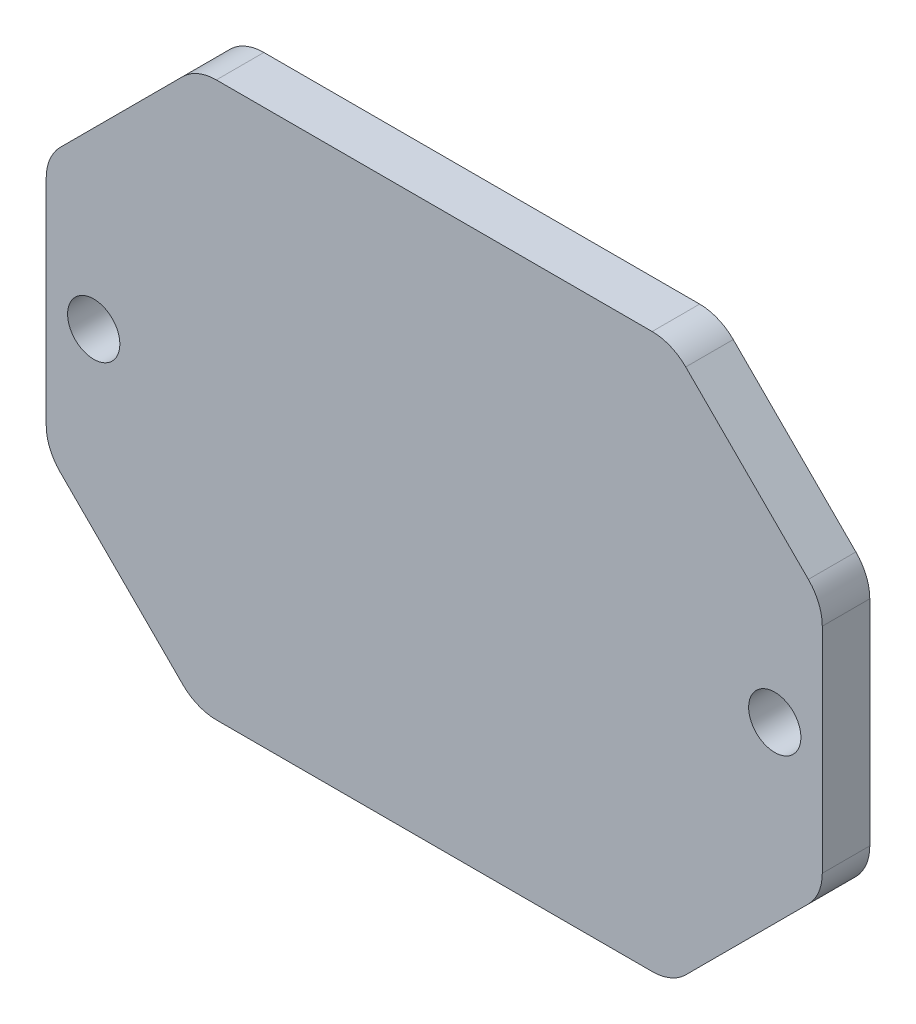
ISO-10303-21;
HEADER;
FILE_DESCRIPTION(('STEP AP214'),'2;1');
FILE_NAME('part.step','',(''),(''),'','','');
FILE_SCHEMA(('AUTOMOTIVE_DESIGN { 1 0 10303 214 1 1 1 1 }'));
ENDSEC;
DATA;
#1=APPLICATION_CONTEXT('core data for automotive mechanical design processes');
#2=APPLICATION_PROTOCOL_DEFINITION('international standard','automotive_design',2000,#1);
#3=PRODUCT_CONTEXT('',#1,'mechanical');
#4=PRODUCT('Part','Part','',(#3));
#5=PRODUCT_RELATED_PRODUCT_CATEGORY('part','',(#4));
#6=PRODUCT_DEFINITION_FORMATION('','',#4);
#7=PRODUCT_DEFINITION_CONTEXT('part definition',#1,'design');
#8=PRODUCT_DEFINITION('design','',#6,#7);
#9=PRODUCT_DEFINITION_SHAPE('','',#8);
#10=(LENGTH_UNIT() NAMED_UNIT(*) SI_UNIT(.MILLI.,.METRE.));
#11=(NAMED_UNIT(*) PLANE_ANGLE_UNIT() SI_UNIT($,.RADIAN.));
#12=(NAMED_UNIT(*) SI_UNIT($,.STERADIAN.) SOLID_ANGLE_UNIT());
#13=UNCERTAINTY_MEASURE_WITH_UNIT(LENGTH_MEASURE(1.E-05),#10,'distance_accuracy_value','');
#14=(GEOMETRIC_REPRESENTATION_CONTEXT(3) GLOBAL_UNCERTAINTY_ASSIGNED_CONTEXT((#13)) GLOBAL_UNIT_ASSIGNED_CONTEXT((#10,
#11,#12)) REPRESENTATION_CONTEXT('',''));
#15=CARTESIAN_POINT('',(0.,0.,0.));
#16=DIRECTION('',(0.,0.,1.));
#17=DIRECTION('',(1.,0.,0.));
#18=AXIS2_PLACEMENT_3D('',#15,#16,#17);
#19=CARTESIAN_POINT('',(24.5,17.4980916030534,3.));
#20=DIRECTION('',(-1.,0.,0.));
#21=DIRECTION('',(0.,-1.,0.));
#22=AXIS2_PLACEMENT_3D('',#19,#20,#21);
#23=PLANE('',#22);
#24=DIRECTION('',(0.,1.,0.));
#25=VECTOR('',#24,1.);
#26=CARTESIAN_POINT('',(24.5,17.4980916030534,3.));
#27=LINE('',#26,#25);
#28=CARTESIAN_POINT('',(24.5,-6.75545091593416,3.));
#29=VERTEX_POINT('',#28);
#30=CARTESIAN_POINT('',(24.5,6.75545091593414,3.));
#31=VERTEX_POINT('',#30);
#32=EDGE_CURVE('E271',#29,#31,#27,.T.);
#33=ORIENTED_EDGE('',*,*,#32,.F.);
#34=DIRECTION('',(0.,0.,1.));
#35=VECTOR('',#34,1.);
#36=CARTESIAN_POINT('',(24.5,-6.75545091593416,0.));
#37=LINE('',#36,#35);
#38=CARTESIAN_POINT('',(24.5,-6.75545091593416,0.));
#39=VERTEX_POINT('',#38);
#40=EDGE_CURVE('E226',#29,#39,#37,.F.);
#41=ORIENTED_EDGE('',*,*,#40,.T.);
#42=DIRECTION('',(0.,1.,0.));
#43=VECTOR('',#42,1.);
#44=CARTESIAN_POINT('',(24.5,17.4980916030534,0.));
#45=LINE('',#44,#43);
#46=CARTESIAN_POINT('',(24.5,6.75545091593414,0.));
#47=VERTEX_POINT('',#46);
#48=EDGE_CURVE('E293',#39,#47,#45,.T.);
#49=ORIENTED_EDGE('',*,*,#48,.T.);
#50=DIRECTION('',(0.,0.,-1.));
#51=VECTOR('',#50,1.);
#52=CARTESIAN_POINT('',(24.5,6.75545091593414,3.));
#53=LINE('',#52,#51);
#54=EDGE_CURVE('E223',#47,#31,#53,.F.);
#55=ORIENTED_EDGE('',*,*,#54,.T.);
#56=EDGE_LOOP('',(#33,#41,#49,#55));
#57=FACE_BOUND('',#56,.T.);
#58=ADVANCED_FACE('F38',(#57),#23,.F.);
#59=CARTESIAN_POINT('',(-24.5,17.4980916030534,3.));
#60=DIRECTION('',(0.,-1.,0.));
#61=DIRECTION('',(0.,0.,-1.));
#62=AXIS2_PLACEMENT_3D('',#59,#60,#61);
#63=PLANE('',#62);
#64=DIRECTION('',(-1.,0.,0.));
#65=VECTOR('',#64,1.);
#66=CARTESIAN_POINT('',(-24.5,17.4980916030534,3.));
#67=LINE('',#66,#65);
#68=CARTESIAN_POINT('',(13.7573593128807,17.4980916030534,3.));
#69=VERTEX_POINT('',#68);
#70=CARTESIAN_POINT('',(-13.7573593128807,17.4980916030534,3.));
#71=VERTEX_POINT('',#70);
#72=EDGE_CURVE('E175',#69,#71,#67,.T.);
#73=ORIENTED_EDGE('',*,*,#72,.F.);
#74=DIRECTION('',(0.,0.,1.));
#75=VECTOR('',#74,1.);
#76=CARTESIAN_POINT('',(13.7573593128807,17.4980916030534,0.));
#77=LINE('',#76,#75);
#78=CARTESIAN_POINT('',(13.7573593128807,17.4980916030534,0.));
#79=VERTEX_POINT('',#78);
#80=EDGE_CURVE('E236',#69,#79,#77,.F.);
#81=ORIENTED_EDGE('',*,*,#80,.T.);
#82=DIRECTION('',(-1.,0.,0.));
#83=VECTOR('',#82,1.);
#84=CARTESIAN_POINT('',(-24.5,17.4980916030534,0.));
#85=LINE('',#84,#83);
#86=CARTESIAN_POINT('',(-13.7573593128807,17.4980916030534,0.));
#87=VERTEX_POINT('',#86);
#88=EDGE_CURVE('E276',#79,#87,#85,.T.);
#89=ORIENTED_EDGE('',*,*,#88,.T.);
#90=DIRECTION('',(0.,0.,-1.));
#91=VECTOR('',#90,1.);
#92=CARTESIAN_POINT('',(-13.7573593128807,17.4980916030534,3.));
#93=LINE('',#92,#91);
#94=EDGE_CURVE('E233',#87,#71,#93,.F.);
#95=ORIENTED_EDGE('',*,*,#94,.T.);
#96=EDGE_LOOP('',(#73,#81,#89,#95));
#97=FACE_BOUND('',#96,.T.);
#98=ADVANCED_FACE('F301',(#97),#63,.F.);
#99=CARTESIAN_POINT('',(-24.5,17.4980916030534,3.));
#100=DIRECTION('',(1.,0.,0.));
#101=DIRECTION('',(0.,1.,0.));
#102=AXIS2_PLACEMENT_3D('',#99,#100,#101);
#103=PLANE('',#102);
#104=DIRECTION('',(0.,-1.,0.));
#105=VECTOR('',#104,1.);
#106=CARTESIAN_POINT('',(-24.5,17.4980916030534,0.));
#107=LINE('',#106,#105);
#108=CARTESIAN_POINT('',(-24.5,6.75545091593416,0.));
#109=VERTEX_POINT('',#108);
#110=CARTESIAN_POINT('',(-24.5,-6.75545091593414,0.));
#111=VERTEX_POINT('',#110);
#112=EDGE_CURVE('E272',#109,#111,#107,.T.);
#113=ORIENTED_EDGE('',*,*,#112,.T.);
#114=DIRECTION('',(0.,0.,-1.));
#115=VECTOR('',#114,1.);
#116=CARTESIAN_POINT('',(-24.5,-6.75545091593414,3.));
#117=LINE('',#116,#115);
#118=CARTESIAN_POINT('',(-24.5,-6.75545091593414,3.));
#119=VERTEX_POINT('',#118);
#120=EDGE_CURVE('E164',#111,#119,#117,.F.);
#121=ORIENTED_EDGE('',*,*,#120,.T.);
#122=DIRECTION('',(0.,-1.,0.));
#123=VECTOR('',#122,1.);
#124=CARTESIAN_POINT('',(-24.5,17.4980916030534,3.));
#125=LINE('',#124,#123);
#126=CARTESIAN_POINT('',(-24.5,6.75545091593416,3.));
#127=VERTEX_POINT('',#126);
#128=EDGE_CURVE('E157',#127,#119,#125,.T.);
#129=ORIENTED_EDGE('',*,*,#128,.F.);
#130=DIRECTION('',(0.,0.,1.));
#131=VECTOR('',#130,1.);
#132=CARTESIAN_POINT('',(-24.5,6.75545091593416,0.));
#133=LINE('',#132,#131);
#134=EDGE_CURVE('E171',#127,#109,#133,.F.);
#135=ORIENTED_EDGE('',*,*,#134,.T.);
#136=EDGE_LOOP('',(#113,#121,#129,#135));
#137=FACE_BOUND('',#136,.T.);
#138=ADVANCED_FACE('F170',(#137),#103,.F.);
#139=CARTESIAN_POINT('',(-24.5,-17.4980916030534,3.));
#140=DIRECTION('',(0.,1.,0.));
#141=DIRECTION('',(0.,0.,1.));
#142=AXIS2_PLACEMENT_3D('',#139,#140,#141);
#143=PLANE('',#142);
#144=DIRECTION('',(1.,0.,0.));
#145=VECTOR('',#144,1.);
#146=CARTESIAN_POINT('',(-24.5,-17.4980916030534,3.));
#147=LINE('',#146,#145);
#148=CARTESIAN_POINT('',(-13.7573593128807,-17.4980916030534,3.));
#149=VERTEX_POINT('',#148);
#150=CARTESIAN_POINT('',(13.7573593128807,-17.4980916030534,3.));
#151=VERTEX_POINT('',#150);
#152=EDGE_CURVE('E174',#149,#151,#147,.T.);
#153=ORIENTED_EDGE('',*,*,#152,.F.);
#154=DIRECTION('',(0.,0.,1.));
#155=VECTOR('',#154,1.);
#156=CARTESIAN_POINT('',(-13.7573593128807,-17.4980916030534,0.));
#157=LINE('',#156,#155);
#158=CARTESIAN_POINT('',(-13.7573593128807,-17.4980916030534,0.));
#159=VERTEX_POINT('',#158);
#160=EDGE_CURVE('E217',#149,#159,#157,.F.);
#161=ORIENTED_EDGE('',*,*,#160,.T.);
#162=DIRECTION('',(1.,0.,0.));
#163=VECTOR('',#162,1.);
#164=CARTESIAN_POINT('',(-24.5,-17.4980916030534,0.));
#165=LINE('',#164,#163);
#166=CARTESIAN_POINT('',(13.7573593128807,-17.4980916030534,0.));
#167=VERTEX_POINT('',#166);
#168=EDGE_CURVE('E267',#159,#167,#165,.T.);
#169=ORIENTED_EDGE('',*,*,#168,.T.);
#170=DIRECTION('',(0.,0.,-1.));
#171=VECTOR('',#170,1.);
#172=CARTESIAN_POINT('',(13.7573593128807,-17.4980916030534,3.));
#173=LINE('',#172,#171);
#174=EDGE_CURVE('E214',#167,#151,#173,.F.);
#175=ORIENTED_EDGE('',*,*,#174,.T.);
#176=EDGE_LOOP('',(#153,#161,#169,#175));
#177=FACE_BOUND('',#176,.T.);
#178=ADVANCED_FACE('F266',(#177),#143,.F.);
#179=CARTESIAN_POINT('',(0.,0.,3.));
#180=DIRECTION('',(0.,0.,1.));
#181=DIRECTION('',(1.,0.,0.));
#182=AXIS2_PLACEMENT_3D('',#179,#180,#181);
#183=PLANE('',#182);
#184=CARTESIAN_POINT('',(-21.5,0.,3.));
#185=DIRECTION('',(0.,0.,1.));
#186=DIRECTION('',(1.,0.,0.));
#187=AXIS2_PLACEMENT_3D('',#184,#185,#186);
#188=CIRCLE('',#187,1.65);
#189=CARTESIAN_POINT('',(-19.85,0.,3.));
#190=VERTEX_POINT('',#189);
#191=EDGE_CURVE('E314',#190,#190,#188,.T.);
#192=ORIENTED_EDGE('',*,*,#191,.F.);
#193=EDGE_LOOP('',(#192));
#194=FACE_BOUND('',#193,.T.);
#195=CARTESIAN_POINT('',(21.5,0.,3.));
#196=DIRECTION('',(0.,0.,1.));
#197=DIRECTION('',(1.,0.,0.));
#198=AXIS2_PLACEMENT_3D('',#195,#196,#197);
#199=CIRCLE('',#198,1.65);
#200=CARTESIAN_POINT('',(23.15,0.,3.));
#201=VERTEX_POINT('',#200);
#202=EDGE_CURVE('E308',#201,#201,#199,.T.);
#203=ORIENTED_EDGE('',*,*,#202,.F.);
#204=EDGE_LOOP('',(#203));
#205=FACE_BOUND('',#204,.T.);
#206=ORIENTED_EDGE('',*,*,#128,.T.);
#207=CARTESIAN_POINT('',(-21.5,-6.75545091593414,3.));
#208=DIRECTION('',(0.,0.,1.));
#209=DIRECTION('',(1.,0.,0.));
#210=AXIS2_PLACEMENT_3D('',#207,#208,#209);
#211=CIRCLE('',#210,3.);
#212=CARTESIAN_POINT('',(-23.6213203435596,-8.87677125949378,3.));
#213=VERTEX_POINT('',#212);
#214=EDGE_CURVE('E195',#119,#213,#211,.T.);
#215=ORIENTED_EDGE('',*,*,#214,.T.);
#216=DIRECTION('',(-0.707106781186546,0.707106781186549,0.));
#217=VECTOR('',#216,1.);
#218=CARTESIAN_POINT('',(-16.2490458015267,-16.2490458015267,3.));
#219=LINE('',#218,#217);
#220=CARTESIAN_POINT('',(-15.8786796564404,-16.6194119466131,3.));
#221=VERTEX_POINT('',#220);
#222=EDGE_CURVE('E180',#213,#221,#219,.F.);
#223=ORIENTED_EDGE('',*,*,#222,.T.);
#224=CARTESIAN_POINT('',(-13.7573593128807,-14.4980916030534,3.));
#225=DIRECTION('',(0.,0.,1.));
#226=DIRECTION('',(1.,0.,0.));
#227=AXIS2_PLACEMENT_3D('',#224,#225,#226);
#228=CIRCLE('',#227,3.);
#229=EDGE_CURVE('E193',#221,#149,#228,.T.);
#230=ORIENTED_EDGE('',*,*,#229,.T.);
#231=ORIENTED_EDGE('',*,*,#152,.T.);
#232=CARTESIAN_POINT('',(13.7573593128807,-14.4980916030534,3.));
#233=DIRECTION('',(0.,0.,1.));
#234=DIRECTION('',(1.,0.,0.));
#235=AXIS2_PLACEMENT_3D('',#232,#233,#234);
#236=CIRCLE('',#235,3.);
#237=CARTESIAN_POINT('',(15.8786796564403,-16.6194119466131,3.));
#238=VERTEX_POINT('',#237);
#239=EDGE_CURVE('E191',#151,#238,#236,.T.);
#240=ORIENTED_EDGE('',*,*,#239,.T.);
#241=DIRECTION('',(-0.707106781186549,-0.707106781186546,0.));
#242=VECTOR('',#241,1.);
#243=CARTESIAN_POINT('',(16.2490458015267,-16.2490458015267,3.));
#244=LINE('',#243,#242);
#245=CARTESIAN_POINT('',(23.6213203435596,-8.87677125949381,3.));
#246=VERTEX_POINT('',#245);
#247=EDGE_CURVE('E249',#238,#246,#244,.F.);
#248=ORIENTED_EDGE('',*,*,#247,.T.);
#249=CARTESIAN_POINT('',(21.5,-6.75545091593416,3.));
#250=DIRECTION('',(0.,0.,1.));
#251=DIRECTION('',(1.,0.,0.));
#252=AXIS2_PLACEMENT_3D('',#249,#250,#251);
#253=CIRCLE('',#252,3.);
#254=EDGE_CURVE('E189',#246,#29,#253,.T.);
#255=ORIENTED_EDGE('',*,*,#254,.T.);
#256=ORIENTED_EDGE('',*,*,#32,.T.);
#257=CARTESIAN_POINT('',(21.5,6.75545091593414,3.));
#258=DIRECTION('',(0.,0.,1.));
#259=DIRECTION('',(1.,0.,0.));
#260=AXIS2_PLACEMENT_3D('',#257,#258,#259);
#261=CIRCLE('',#260,3.);
#262=CARTESIAN_POINT('',(23.6213203435596,8.87677125949378,3.));
#263=VERTEX_POINT('',#262);
#264=EDGE_CURVE('E187',#31,#263,#261,.T.);
#265=ORIENTED_EDGE('',*,*,#264,.T.);
#266=DIRECTION('',(0.707106781186547,-0.707106781186549,0.));
#267=VECTOR('',#266,1.);
#268=CARTESIAN_POINT('',(16.2490458015267,16.2490458015267,3.));
#269=LINE('',#268,#267);
#270=CARTESIAN_POINT('',(15.8786796564404,16.6194119466131,3.));
#271=VERTEX_POINT('',#270);
#272=EDGE_CURVE('E245',#263,#271,#269,.F.);
#273=ORIENTED_EDGE('',*,*,#272,.T.);
#274=CARTESIAN_POINT('',(13.7573593128807,14.4980916030534,3.));
#275=DIRECTION('',(0.,0.,1.));
#276=DIRECTION('',(1.,0.,0.));
#277=AXIS2_PLACEMENT_3D('',#274,#275,#276);
#278=CIRCLE('',#277,3.);
#279=EDGE_CURVE('E185',#271,#69,#278,.T.);
#280=ORIENTED_EDGE('',*,*,#279,.T.);
#281=ORIENTED_EDGE('',*,*,#72,.T.);
#282=CARTESIAN_POINT('',(-13.7573593128807,14.4980916030534,3.));
#283=DIRECTION('',(0.,0.,1.));
#284=DIRECTION('',(1.,0.,0.));
#285=AXIS2_PLACEMENT_3D('',#282,#283,#284);
#286=CIRCLE('',#285,3.);
#287=CARTESIAN_POINT('',(-15.8786796564403,16.6194119466131,3.));
#288=VERTEX_POINT('',#287);
#289=EDGE_CURVE('E163',#71,#288,#286,.T.);
#290=ORIENTED_EDGE('',*,*,#289,.T.);
#291=DIRECTION('',(0.707106781186549,0.707106781186546,0.));
#292=VECTOR('',#291,1.);
#293=CARTESIAN_POINT('',(-16.2490458015267,16.2490458015267,3.));
#294=LINE('',#293,#292);
#295=CARTESIAN_POINT('',(-23.6213203435596,8.87677125949381,3.));
#296=VERTEX_POINT('',#295);
#297=EDGE_CURVE('E159',#288,#296,#294,.F.);
#298=ORIENTED_EDGE('',*,*,#297,.T.);
#299=CARTESIAN_POINT('',(-21.5,6.75545091593416,3.));
#300=DIRECTION('',(0.,0.,1.));
#301=DIRECTION('',(1.,0.,0.));
#302=AXIS2_PLACEMENT_3D('',#299,#300,#301);
#303=CIRCLE('',#302,3.);
#304=EDGE_CURVE('E154',#296,#127,#303,.T.);
#305=ORIENTED_EDGE('',*,*,#304,.T.);
#306=EDGE_LOOP('',(#206,#215,#223,#230,#231,#240,#248,#255,#256,#265,#273,#280,#281,#290,#298,#305));
#307=FACE_BOUND('',#306,.T.);
#308=ADVANCED_FACE('F156',(#194,#205,#307),#183,.T.);
#309=CARTESIAN_POINT('',(0.,0.,0.));
#310=DIRECTION('',(0.,0.,1.));
#311=DIRECTION('',(1.,0.,0.));
#312=AXIS2_PLACEMENT_3D('',#309,#310,#311);
#313=PLANE('',#312);
#314=CARTESIAN_POINT('',(-21.5,0.,0.));
#315=DIRECTION('',(0.,0.,1.));
#316=DIRECTION('',(1.,0.,0.));
#317=AXIS2_PLACEMENT_3D('',#314,#315,#316);
#318=CIRCLE('',#317,1.65);
#319=CARTESIAN_POINT('',(-19.85,0.,0.));
#320=VERTEX_POINT('',#319);
#321=EDGE_CURVE('E295',#320,#320,#318,.T.);
#322=ORIENTED_EDGE('',*,*,#321,.T.);
#323=EDGE_LOOP('',(#322));
#324=FACE_BOUND('',#323,.T.);
#325=CARTESIAN_POINT('',(21.5,0.,0.));
#326=DIRECTION('',(0.,0.,1.));
#327=DIRECTION('',(1.,0.,0.));
#328=AXIS2_PLACEMENT_3D('',#325,#326,#327);
#329=CIRCLE('',#328,1.65);
#330=CARTESIAN_POINT('',(23.15,0.,0.));
#331=VERTEX_POINT('',#330);
#332=EDGE_CURVE('E311',#331,#331,#329,.T.);
#333=ORIENTED_EDGE('',*,*,#332,.T.);
#334=EDGE_LOOP('',(#333));
#335=FACE_BOUND('',#334,.T.);
#336=DIRECTION('',(0.707106781186546,-0.707106781186549,0.));
#337=VECTOR('',#336,1.);
#338=CARTESIAN_POINT('',(-15.,-17.4980916030534,0.));
#339=LINE('',#338,#337);
#340=CARTESIAN_POINT('',(-15.8786796564404,-16.6194119466131,0.));
#341=VERTEX_POINT('',#340);
#342=CARTESIAN_POINT('',(-23.6213203435596,-8.87677125949377,0.));
#343=VERTEX_POINT('',#342);
#344=EDGE_CURVE('E246',#341,#343,#339,.F.);
#345=ORIENTED_EDGE('',*,*,#344,.T.);
#346=CARTESIAN_POINT('',(-21.5,-6.75545091593414,0.));
#347=DIRECTION('',(0.,0.,1.));
#348=DIRECTION('',(1.,0.,0.));
#349=AXIS2_PLACEMENT_3D('',#346,#347,#348);
#350=CIRCLE('',#349,3.);
#351=EDGE_CURVE('E212',#343,#111,#350,.F.);
#352=ORIENTED_EDGE('',*,*,#351,.T.);
#353=ORIENTED_EDGE('',*,*,#112,.F.);
#354=CARTESIAN_POINT('',(-21.5,6.75545091593416,0.));
#355=DIRECTION('',(0.,0.,1.));
#356=DIRECTION('',(1.,0.,0.));
#357=AXIS2_PLACEMENT_3D('',#354,#355,#356);
#358=CIRCLE('',#357,3.);
#359=CARTESIAN_POINT('',(-23.6213203435596,8.87677125949381,0.));
#360=VERTEX_POINT('',#359);
#361=EDGE_CURVE('E177',#109,#360,#358,.F.);
#362=ORIENTED_EDGE('',*,*,#361,.T.);
#363=DIRECTION('',(-0.707106781186549,-0.707106781186546,0.));
#364=VECTOR('',#363,1.);
#365=CARTESIAN_POINT('',(-24.5,7.99809160305345,0.));
#366=LINE('',#365,#364);
#367=CARTESIAN_POINT('',(-15.8786796564403,16.6194119466131,0.));
#368=VERTEX_POINT('',#367);
#369=EDGE_CURVE('E243',#360,#368,#366,.F.);
#370=ORIENTED_EDGE('',*,*,#369,.T.);
#371=CARTESIAN_POINT('',(-13.7573593128807,14.4980916030534,0.));
#372=DIRECTION('',(0.,0.,1.));
#373=DIRECTION('',(1.,0.,0.));
#374=AXIS2_PLACEMENT_3D('',#371,#372,#373);
#375=CIRCLE('',#374,3.);
#376=EDGE_CURVE('E202',#368,#87,#375,.F.);
#377=ORIENTED_EDGE('',*,*,#376,.T.);
#378=ORIENTED_EDGE('',*,*,#88,.F.);
#379=CARTESIAN_POINT('',(13.7573593128807,14.4980916030534,0.));
#380=DIRECTION('',(0.,0.,1.));
#381=DIRECTION('',(1.,0.,0.));
#382=AXIS2_PLACEMENT_3D('',#379,#380,#381);
#383=CIRCLE('',#382,3.);
#384=CARTESIAN_POINT('',(15.8786796564404,16.6194119466131,0.));
#385=VERTEX_POINT('',#384);
#386=EDGE_CURVE('E204',#79,#385,#383,.F.);
#387=ORIENTED_EDGE('',*,*,#386,.T.);
#388=DIRECTION('',(-0.707106781186547,0.707106781186549,0.));
#389=VECTOR('',#388,1.);
#390=CARTESIAN_POINT('',(15.,17.4980916030534,0.));
#391=LINE('',#390,#389);
#392=CARTESIAN_POINT('',(23.6213203435596,8.87677125949377,0.));
#393=VERTEX_POINT('',#392);
#394=EDGE_CURVE('E280',#385,#393,#391,.F.);
#395=ORIENTED_EDGE('',*,*,#394,.T.);
#396=CARTESIAN_POINT('',(21.5,6.75545091593414,0.));
#397=DIRECTION('',(0.,0.,1.));
#398=DIRECTION('',(1.,0.,0.));
#399=AXIS2_PLACEMENT_3D('',#396,#397,#398);
#400=CIRCLE('',#399,3.);
#401=EDGE_CURVE('E206',#393,#47,#400,.F.);
#402=ORIENTED_EDGE('',*,*,#401,.T.);
#403=ORIENTED_EDGE('',*,*,#48,.F.);
#404=CARTESIAN_POINT('',(21.5,-6.75545091593416,0.));
#405=DIRECTION('',(0.,0.,1.));
#406=DIRECTION('',(1.,0.,0.));
#407=AXIS2_PLACEMENT_3D('',#404,#405,#406);
#408=CIRCLE('',#407,3.);
#409=CARTESIAN_POINT('',(23.6213203435596,-8.87677125949381,0.));
#410=VERTEX_POINT('',#409);
#411=EDGE_CURVE('E208',#39,#410,#408,.F.);
#412=ORIENTED_EDGE('',*,*,#411,.T.);
#413=DIRECTION('',(0.707106781186549,0.707106781186546,0.));
#414=VECTOR('',#413,1.);
#415=CARTESIAN_POINT('',(24.5,-7.99809160305345,0.));
#416=LINE('',#415,#414);
#417=CARTESIAN_POINT('',(15.8786796564403,-16.6194119466131,0.));
#418=VERTEX_POINT('',#417);
#419=EDGE_CURVE('E252',#410,#418,#416,.F.);
#420=ORIENTED_EDGE('',*,*,#419,.T.);
#421=CARTESIAN_POINT('',(13.7573593128807,-14.4980916030534,0.));
#422=DIRECTION('',(0.,0.,1.));
#423=DIRECTION('',(1.,0.,0.));
#424=AXIS2_PLACEMENT_3D('',#421,#422,#423);
#425=CIRCLE('',#424,3.);
#426=EDGE_CURVE('E53',#418,#167,#425,.F.);
#427=ORIENTED_EDGE('',*,*,#426,.T.);
#428=ORIENTED_EDGE('',*,*,#168,.F.);
#429=CARTESIAN_POINT('',(-13.7573593128807,-14.4980916030534,0.));
#430=DIRECTION('',(0.,0.,1.));
#431=DIRECTION('',(1.,0.,0.));
#432=AXIS2_PLACEMENT_3D('',#429,#430,#431);
#433=CIRCLE('',#432,3.);
#434=EDGE_CURVE('E61',#159,#341,#433,.F.);
#435=ORIENTED_EDGE('',*,*,#434,.T.);
#436=EDGE_LOOP('',(#345,#352,#353,#362,#370,#377,#378,#387,#395,#402,#403,#412,#420,#427,#428,#435));
#437=FACE_BOUND('',#436,.T.);
#438=ADVANCED_FACE('F269',(#324,#335,#437),#313,.F.);
#439=CARTESIAN_POINT('',(-24.5,7.99809160305345,3.));
#440=DIRECTION('',(0.707106781186546,-0.707106781186549,0.));
#441=DIRECTION('',(0.,0.,-1.));
#442=AXIS2_PLACEMENT_3D('',#439,#440,#441);
#443=PLANE('',#442);
#444=ORIENTED_EDGE('',*,*,#297,.F.);
#445=DIRECTION('',(0.,0.,1.));
#446=VECTOR('',#445,1.);
#447=CARTESIAN_POINT('',(-15.8786796564403,16.6194119466131,0.));
#448=LINE('',#447,#446);
#449=EDGE_CURVE('E11',#288,#368,#448,.F.);
#450=ORIENTED_EDGE('',*,*,#449,.T.);
#451=ORIENTED_EDGE('',*,*,#369,.F.);
#452=DIRECTION('',(0.,0.,-1.));
#453=VECTOR('',#452,1.);
#454=CARTESIAN_POINT('',(-23.6213203435596,8.87677125949381,3.));
#455=LINE('',#454,#453);
#456=EDGE_CURVE('E46',#360,#296,#455,.F.);
#457=ORIENTED_EDGE('',*,*,#456,.T.);
#458=EDGE_LOOP('',(#444,#450,#451,#457));
#459=FACE_BOUND('',#458,.T.);
#460=ADVANCED_FACE('F240',(#459),#443,.F.);
#461=CARTESIAN_POINT('',(-15.,-17.4980916030534,3.));
#462=DIRECTION('',(0.707106781186549,0.707106781186546,0.));
#463=DIRECTION('',(0.,0.,-1.));
#464=AXIS2_PLACEMENT_3D('',#461,#462,#463);
#465=PLANE('',#464);
#466=ORIENTED_EDGE('',*,*,#222,.F.);
#467=DIRECTION('',(0.,0.,1.));
#468=VECTOR('',#467,1.);
#469=CARTESIAN_POINT('',(-23.6213203435596,-8.87677125949378,0.));
#470=LINE('',#469,#468);
#471=EDGE_CURVE('E199',#213,#343,#470,.F.);
#472=ORIENTED_EDGE('',*,*,#471,.T.);
#473=ORIENTED_EDGE('',*,*,#344,.F.);
#474=DIRECTION('',(0.,0.,-1.));
#475=VECTOR('',#474,1.);
#476=CARTESIAN_POINT('',(-15.8786796564404,-16.6194119466131,3.));
#477=LINE('',#476,#475);
#478=EDGE_CURVE('E197',#341,#221,#477,.F.);
#479=ORIENTED_EDGE('',*,*,#478,.T.);
#480=EDGE_LOOP('',(#466,#472,#473,#479));
#481=FACE_BOUND('',#480,.T.);
#482=ADVANCED_FACE('F357',(#481),#465,.F.);
#483=CARTESIAN_POINT('',(24.5,-7.99809160305345,3.));
#484=DIRECTION('',(-0.707106781186546,0.707106781186549,0.));
#485=DIRECTION('',(0.,0.,-1.));
#486=AXIS2_PLACEMENT_3D('',#483,#484,#485);
#487=PLANE('',#486);
#488=ORIENTED_EDGE('',*,*,#247,.F.);
#489=DIRECTION('',(0.,0.,1.));
#490=VECTOR('',#489,1.);
#491=CARTESIAN_POINT('',(15.8786796564403,-16.6194119466131,0.));
#492=LINE('',#491,#490);
#493=EDGE_CURVE('E221',#238,#418,#492,.F.);
#494=ORIENTED_EDGE('',*,*,#493,.T.);
#495=ORIENTED_EDGE('',*,*,#419,.F.);
#496=DIRECTION('',(0.,0.,-1.));
#497=VECTOR('',#496,1.);
#498=CARTESIAN_POINT('',(23.6213203435596,-8.87677125949381,3.));
#499=LINE('',#498,#497);
#500=EDGE_CURVE('E219',#410,#246,#499,.F.);
#501=ORIENTED_EDGE('',*,*,#500,.T.);
#502=EDGE_LOOP('',(#488,#494,#495,#501));
#503=FACE_BOUND('',#502,.T.);
#504=ADVANCED_FACE('F363',(#503),#487,.F.);
#505=CARTESIAN_POINT('',(15.,17.4980916030534,3.));
#506=DIRECTION('',(-0.707106781186548,-0.707106781186546,0.));
#507=DIRECTION('',(0.,0.,-1.));
#508=AXIS2_PLACEMENT_3D('',#505,#506,#507);
#509=PLANE('',#508);
#510=ORIENTED_EDGE('',*,*,#272,.F.);
#511=DIRECTION('',(0.,0.,1.));
#512=VECTOR('',#511,1.);
#513=CARTESIAN_POINT('',(23.6213203435596,8.87677125949378,0.));
#514=LINE('',#513,#512);
#515=EDGE_CURVE('E231',#263,#393,#514,.F.);
#516=ORIENTED_EDGE('',*,*,#515,.T.);
#517=ORIENTED_EDGE('',*,*,#394,.F.);
#518=DIRECTION('',(0.,0.,-1.));
#519=VECTOR('',#518,1.);
#520=CARTESIAN_POINT('',(15.8786796564404,16.6194119466131,3.));
#521=LINE('',#520,#519);
#522=EDGE_CURVE('E229',#385,#271,#521,.F.);
#523=ORIENTED_EDGE('',*,*,#522,.T.);
#524=EDGE_LOOP('',(#510,#516,#517,#523));
#525=FACE_BOUND('',#524,.T.);
#526=ADVANCED_FACE('F369',(#525),#509,.F.);
#527=CARTESIAN_POINT('',(-21.5,-6.75545091593414,3.));
#528=DIRECTION('',(0.,0.,1.));
#529=DIRECTION('',(1.,0.,0.));
#530=AXIS2_PLACEMENT_3D('',#527,#528,#529);
#531=CYLINDRICAL_SURFACE('',#530,3.);
#532=ORIENTED_EDGE('',*,*,#351,.F.);
#533=ORIENTED_EDGE('',*,*,#471,.F.);
#534=ORIENTED_EDGE('',*,*,#214,.F.);
#535=ORIENTED_EDGE('',*,*,#120,.F.);
#536=EDGE_LOOP('',(#532,#533,#534,#535));
#537=FACE_BOUND('',#536,.T.);
#538=ADVANCED_FACE('F374',(#537),#531,.T.);
#539=CARTESIAN_POINT('',(-13.7573593128807,-14.4980916030534,3.));
#540=DIRECTION('',(0.,0.,-1.));
#541=DIRECTION('',(-1.,0.,0.));
#542=AXIS2_PLACEMENT_3D('',#539,#540,#541);
#543=CYLINDRICAL_SURFACE('',#542,3.);
#544=ORIENTED_EDGE('',*,*,#229,.F.);
#545=ORIENTED_EDGE('',*,*,#478,.F.);
#546=ORIENTED_EDGE('',*,*,#434,.F.);
#547=ORIENTED_EDGE('',*,*,#160,.F.);
#548=EDGE_LOOP('',(#544,#545,#546,#547));
#549=FACE_BOUND('',#548,.T.);
#550=ADVANCED_FACE('F264',(#549),#543,.T.);
#551=CARTESIAN_POINT('',(13.7573593128807,-14.4980916030534,3.));
#552=DIRECTION('',(0.,0.,1.));
#553=DIRECTION('',(1.,0.,0.));
#554=AXIS2_PLACEMENT_3D('',#551,#552,#553);
#555=CYLINDRICAL_SURFACE('',#554,3.);
#556=ORIENTED_EDGE('',*,*,#426,.F.);
#557=ORIENTED_EDGE('',*,*,#493,.F.);
#558=ORIENTED_EDGE('',*,*,#239,.F.);
#559=ORIENTED_EDGE('',*,*,#174,.F.);
#560=EDGE_LOOP('',(#556,#557,#558,#559));
#561=FACE_BOUND('',#560,.T.);
#562=ADVANCED_FACE('F288',(#561),#555,.T.);
#563=CARTESIAN_POINT('',(21.5,-6.75545091593416,3.));
#564=DIRECTION('',(0.,0.,-1.));
#565=DIRECTION('',(-1.,0.,0.));
#566=AXIS2_PLACEMENT_3D('',#563,#564,#565);
#567=CYLINDRICAL_SURFACE('',#566,3.);
#568=ORIENTED_EDGE('',*,*,#254,.F.);
#569=ORIENTED_EDGE('',*,*,#500,.F.);
#570=ORIENTED_EDGE('',*,*,#411,.F.);
#571=ORIENTED_EDGE('',*,*,#40,.F.);
#572=EDGE_LOOP('',(#568,#569,#570,#571));
#573=FACE_BOUND('',#572,.T.);
#574=ADVANCED_FACE('F383',(#573),#567,.T.);
#575=CARTESIAN_POINT('',(21.5,6.75545091593414,3.));
#576=DIRECTION('',(0.,0.,1.));
#577=DIRECTION('',(1.,0.,0.));
#578=AXIS2_PLACEMENT_3D('',#575,#576,#577);
#579=CYLINDRICAL_SURFACE('',#578,3.);
#580=ORIENTED_EDGE('',*,*,#401,.F.);
#581=ORIENTED_EDGE('',*,*,#515,.F.);
#582=ORIENTED_EDGE('',*,*,#264,.F.);
#583=ORIENTED_EDGE('',*,*,#54,.F.);
#584=EDGE_LOOP('',(#580,#581,#582,#583));
#585=FACE_BOUND('',#584,.T.);
#586=ADVANCED_FACE('F386',(#585),#579,.T.);
#587=CARTESIAN_POINT('',(13.7573593128807,14.4980916030534,3.));
#588=DIRECTION('',(0.,0.,-1.));
#589=DIRECTION('',(-1.,0.,0.));
#590=AXIS2_PLACEMENT_3D('',#587,#588,#589);
#591=CYLINDRICAL_SURFACE('',#590,3.);
#592=ORIENTED_EDGE('',*,*,#279,.F.);
#593=ORIENTED_EDGE('',*,*,#522,.F.);
#594=ORIENTED_EDGE('',*,*,#386,.F.);
#595=ORIENTED_EDGE('',*,*,#80,.F.);
#596=EDGE_LOOP('',(#592,#593,#594,#595));
#597=FACE_BOUND('',#596,.T.);
#598=ADVANCED_FACE('F390',(#597),#591,.T.);
#599=CARTESIAN_POINT('',(-13.7573593128807,14.4980916030534,3.));
#600=DIRECTION('',(0.,0.,1.));
#601=DIRECTION('',(1.,0.,0.));
#602=AXIS2_PLACEMENT_3D('',#599,#600,#601);
#603=CYLINDRICAL_SURFACE('',#602,3.);
#604=ORIENTED_EDGE('',*,*,#376,.F.);
#605=ORIENTED_EDGE('',*,*,#449,.F.);
#606=ORIENTED_EDGE('',*,*,#289,.F.);
#607=ORIENTED_EDGE('',*,*,#94,.F.);
#608=EDGE_LOOP('',(#604,#605,#606,#607));
#609=FACE_BOUND('',#608,.T.);
#610=ADVANCED_FACE('F305',(#609),#603,.T.);
#611=CARTESIAN_POINT('',(-21.5,6.75545091593416,3.));
#612=DIRECTION('',(0.,0.,-1.));
#613=DIRECTION('',(-1.,0.,0.));
#614=AXIS2_PLACEMENT_3D('',#611,#612,#613);
#615=CYLINDRICAL_SURFACE('',#614,3.);
#616=ORIENTED_EDGE('',*,*,#304,.F.);
#617=ORIENTED_EDGE('',*,*,#456,.F.);
#618=ORIENTED_EDGE('',*,*,#361,.F.);
#619=ORIENTED_EDGE('',*,*,#134,.F.);
#620=EDGE_LOOP('',(#616,#617,#618,#619));
#621=FACE_BOUND('',#620,.T.);
#622=ADVANCED_FACE('F40',(#621),#615,.T.);
#623=CARTESIAN_POINT('',(21.5,0.,0.));
#624=DIRECTION('',(0.,0.,1.));
#625=DIRECTION('',(1.,0.,0.));
#626=AXIS2_PLACEMENT_3D('',#623,#624,#625);
#627=CYLINDRICAL_SURFACE('',#626,1.65);
#628=ORIENTED_EDGE('',*,*,#332,.F.);
#629=EDGE_LOOP('',(#628));
#630=FACE_BOUND('',#629,.T.);
#631=ORIENTED_EDGE('',*,*,#202,.T.);
#632=EDGE_LOOP('',(#631));
#633=FACE_BOUND('',#632,.T.);
#634=ADVANCED_FACE('F325',(#630,#633),#627,.F.);
#635=CARTESIAN_POINT('',(-21.5,0.,0.));
#636=DIRECTION('',(0.,0.,1.));
#637=DIRECTION('',(1.,0.,0.));
#638=AXIS2_PLACEMENT_3D('',#635,#636,#637);
#639=CYLINDRICAL_SURFACE('',#638,1.65);
#640=ORIENTED_EDGE('',*,*,#321,.F.);
#641=EDGE_LOOP('',(#640));
#642=FACE_BOUND('',#641,.T.);
#643=ORIENTED_EDGE('',*,*,#191,.T.);
#644=EDGE_LOOP('',(#643));
#645=FACE_BOUND('',#644,.T.);
#646=ADVANCED_FACE('F322',(#642,#645),#639,.F.);
#647=CLOSED_SHELL('',(#58,#98,#138,#178,#308,#438,#460,#482,#504,#526,#538,#550,#562,#574,#586,
#598,#610,#622,#634,#646));
#648=MANIFOLD_SOLID_BREP('B2',#647);
#649=ADVANCED_BREP_SHAPE_REPRESENTATION('',(#18,#648),#14);
#650=SHAPE_DEFINITION_REPRESENTATION(#9,#649);
ENDSEC;
END-ISO-10303-21;
